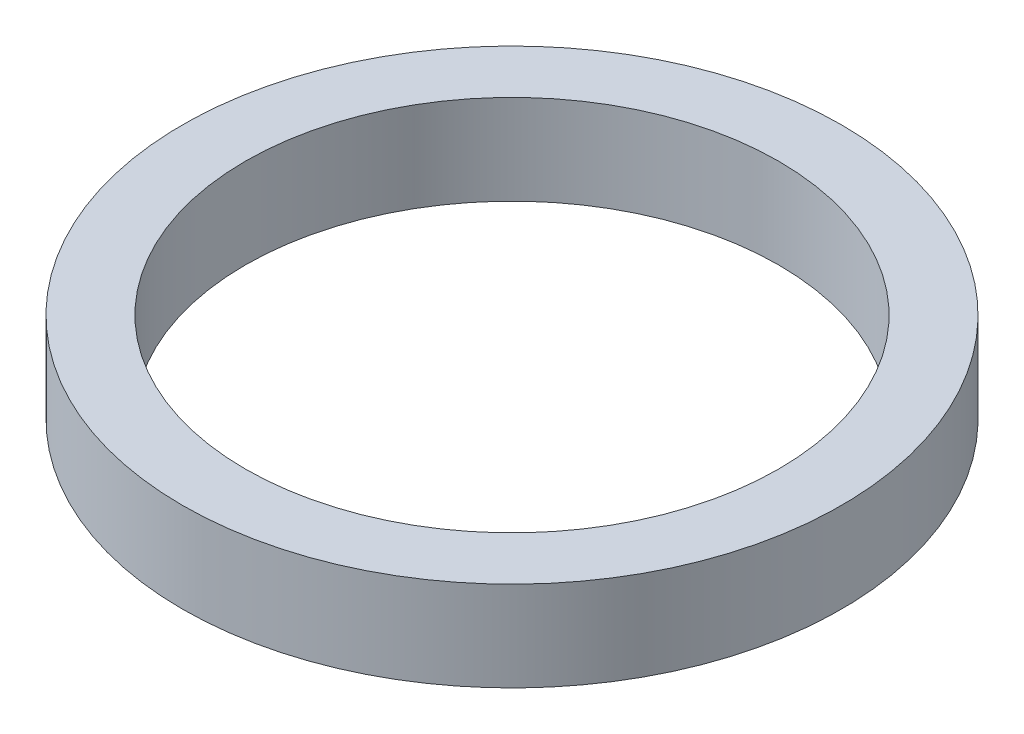
ISO-10303-21;
HEADER;
FILE_DESCRIPTION(('STEP AP214'),'2;1');
FILE_NAME('part.step','',(''),(''),'','','');
FILE_SCHEMA(('AUTOMOTIVE_DESIGN { 1 0 10303 214 1 1 1 1 }'));
ENDSEC;
DATA;
#1=APPLICATION_CONTEXT('core data for automotive mechanical design processes');
#2=APPLICATION_PROTOCOL_DEFINITION('international standard','automotive_design',2000,#1);
#3=PRODUCT_CONTEXT('',#1,'mechanical');
#4=PRODUCT('Part','Part','',(#3));
#5=PRODUCT_RELATED_PRODUCT_CATEGORY('part','',(#4));
#6=PRODUCT_DEFINITION_FORMATION('','',#4);
#7=PRODUCT_DEFINITION_CONTEXT('part definition',#1,'design');
#8=PRODUCT_DEFINITION('design','',#6,#7);
#9=PRODUCT_DEFINITION_SHAPE('','',#8);
#10=(LENGTH_UNIT() NAMED_UNIT(*) SI_UNIT(.MILLI.,.METRE.));
#11=(NAMED_UNIT(*) PLANE_ANGLE_UNIT() SI_UNIT($,.RADIAN.));
#12=(NAMED_UNIT(*) SI_UNIT($,.STERADIAN.) SOLID_ANGLE_UNIT());
#13=UNCERTAINTY_MEASURE_WITH_UNIT(LENGTH_MEASURE(1.E-05),#10,'distance_accuracy_value','');
#14=(GEOMETRIC_REPRESENTATION_CONTEXT(3) GLOBAL_UNCERTAINTY_ASSIGNED_CONTEXT((#13)) GLOBAL_UNIT_ASSIGNED_CONTEXT((#10,
#11,#12)) REPRESENTATION_CONTEXT('',''));
#15=CARTESIAN_POINT('',(0.,0.,0.));
#16=DIRECTION('',(0.,0.,1.));
#17=DIRECTION('',(1.,0.,0.));
#18=AXIS2_PLACEMENT_3D('',#15,#16,#17);
#19=CARTESIAN_POINT('',(0.,3.,0.));
#20=DIRECTION('',(0.,1.,0.));
#21=DIRECTION('',(0.,0.,1.));
#22=AXIS2_PLACEMENT_3D('',#19,#20,#21);
#23=PLANE('',#22);
#24=CARTESIAN_POINT('',(0.,3.,0.));
#25=DIRECTION('',(0.,1.,0.));
#26=DIRECTION('',(0.,0.,1.));
#27=AXIS2_PLACEMENT_3D('',#24,#25,#26);
#28=CIRCLE('',#27,11.);
#29=CARTESIAN_POINT('',(0.,3.,11.));
#30=VERTEX_POINT('',#29);
#31=EDGE_CURVE('E10',#30,#30,#28,.T.);
#32=ORIENTED_EDGE('',*,*,#31,.T.);
#33=EDGE_LOOP('',(#32));
#34=FACE_BOUND('',#33,.T.);
#35=CARTESIAN_POINT('',(0.,3.,0.));
#36=DIRECTION('',(0.,1.,0.));
#37=DIRECTION('',(0.,0.,1.));
#38=AXIS2_PLACEMENT_3D('',#35,#36,#37);
#39=CIRCLE('',#38,8.9);
#40=CARTESIAN_POINT('',(0.,3.,8.9));
#41=VERTEX_POINT('',#40);
#42=EDGE_CURVE('E41',#41,#41,#39,.T.);
#43=ORIENTED_EDGE('',*,*,#42,.F.);
#44=EDGE_LOOP('',(#43));
#45=FACE_BOUND('',#44,.T.);
#46=ADVANCED_FACE('F30',(#34,#45),#23,.T.);
#47=CARTESIAN_POINT('',(0.,0.,0.));
#48=DIRECTION('',(0.,1.,0.));
#49=DIRECTION('',(0.,0.,1.));
#50=AXIS2_PLACEMENT_3D('',#47,#48,#49);
#51=PLANE('',#50);
#52=CARTESIAN_POINT('',(0.,0.,0.));
#53=DIRECTION('',(0.,1.,0.));
#54=DIRECTION('',(0.,0.,1.));
#55=AXIS2_PLACEMENT_3D('',#52,#53,#54);
#56=CIRCLE('',#55,11.);
#57=CARTESIAN_POINT('',(0.,0.,11.));
#58=VERTEX_POINT('',#57);
#59=EDGE_CURVE('E34',#58,#58,#56,.T.);
#60=ORIENTED_EDGE('',*,*,#59,.F.);
#61=EDGE_LOOP('',(#60));
#62=FACE_BOUND('',#61,.T.);
#63=CARTESIAN_POINT('',(0.,0.,0.));
#64=DIRECTION('',(0.,1.,0.));
#65=DIRECTION('',(0.,0.,1.));
#66=AXIS2_PLACEMENT_3D('',#63,#64,#65);
#67=CIRCLE('',#66,8.9);
#68=CARTESIAN_POINT('',(0.,0.,8.9));
#69=VERTEX_POINT('',#68);
#70=EDGE_CURVE('E43',#69,#69,#67,.T.);
#71=ORIENTED_EDGE('',*,*,#70,.T.);
#72=EDGE_LOOP('',(#71));
#73=FACE_BOUND('',#72,.T.);
#74=ADVANCED_FACE('F53',(#62,#73),#51,.F.);
#75=CARTESIAN_POINT('',(0.,3.,0.));
#76=DIRECTION('',(0.,-1.,0.));
#77=DIRECTION('',(0.,0.,-1.));
#78=AXIS2_PLACEMENT_3D('',#75,#76,#77);
#79=CYLINDRICAL_SURFACE('',#78,11.);
#80=ORIENTED_EDGE('',*,*,#31,.F.);
#81=EDGE_LOOP('',(#80));
#82=FACE_BOUND('',#81,.T.);
#83=ORIENTED_EDGE('',*,*,#59,.T.);
#84=EDGE_LOOP('',(#83));
#85=FACE_BOUND('',#84,.T.);
#86=ADVANCED_FACE('F32',(#82,#85),#79,.T.);
#87=CARTESIAN_POINT('',(0.,3.,0.));
#88=DIRECTION('',(0.,-1.,0.));
#89=DIRECTION('',(0.,0.,-1.));
#90=AXIS2_PLACEMENT_3D('',#87,#88,#89);
#91=CYLINDRICAL_SURFACE('',#90,8.9);
#92=ORIENTED_EDGE('',*,*,#42,.T.);
#93=EDGE_LOOP('',(#92));
#94=FACE_BOUND('',#93,.T.);
#95=ORIENTED_EDGE('',*,*,#70,.F.);
#96=EDGE_LOOP('',(#95));
#97=FACE_BOUND('',#96,.T.);
#98=ADVANCED_FACE('F49',(#94,#97),#91,.F.);
#99=CLOSED_SHELL('',(#46,#74,#86,#98));
#100=MANIFOLD_SOLID_BREP('B2',#99);
#101=ADVANCED_BREP_SHAPE_REPRESENTATION('',(#18,#100),#14);
#102=SHAPE_DEFINITION_REPRESENTATION(#9,#101);
ENDSEC;
END-ISO-10303-21;
